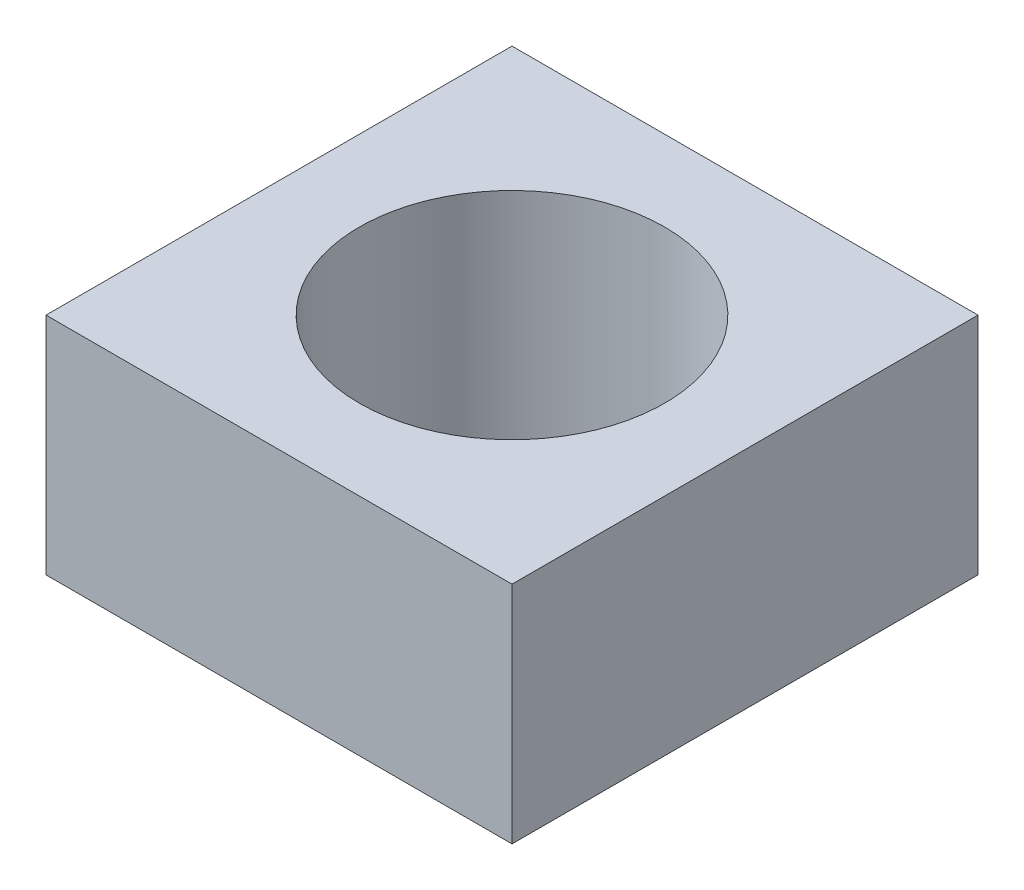
ISO-10303-21;
HEADER;
FILE_DESCRIPTION(('STEP AP214'),'2;1');
FILE_NAME('part.step','',(''),(''),'','','');
FILE_SCHEMA(('AUTOMOTIVE_DESIGN { 1 0 10303 214 1 1 1 1 }'));
ENDSEC;
DATA;
#1=APPLICATION_CONTEXT('core data for automotive mechanical design processes');
#2=APPLICATION_PROTOCOL_DEFINITION('international standard','automotive_design',2000,#1);
#3=PRODUCT_CONTEXT('',#1,'mechanical');
#4=PRODUCT('Part','Part','',(#3));
#5=PRODUCT_RELATED_PRODUCT_CATEGORY('part','',(#4));
#6=PRODUCT_DEFINITION_FORMATION('','',#4);
#7=PRODUCT_DEFINITION_CONTEXT('part definition',#1,'design');
#8=PRODUCT_DEFINITION('design','',#6,#7);
#9=PRODUCT_DEFINITION_SHAPE('','',#8);
#10=(LENGTH_UNIT() NAMED_UNIT(*) SI_UNIT(.MILLI.,.METRE.));
#11=(NAMED_UNIT(*) PLANE_ANGLE_UNIT() SI_UNIT($,.RADIAN.));
#12=(NAMED_UNIT(*) SI_UNIT($,.STERADIAN.) SOLID_ANGLE_UNIT());
#13=UNCERTAINTY_MEASURE_WITH_UNIT(LENGTH_MEASURE(1.E-05),#10,'distance_accuracy_value','');
#14=(GEOMETRIC_REPRESENTATION_CONTEXT(3) GLOBAL_UNCERTAINTY_ASSIGNED_CONTEXT((#13)) GLOBAL_UNIT_ASSIGNED_CONTEXT((#10,
#11,#12)) REPRESENTATION_CONTEXT('',''));
#15=CARTESIAN_POINT('',(0.,0.,0.));
#16=DIRECTION('',(0.,0.,1.));
#17=DIRECTION('',(1.,0.,0.));
#18=AXIS2_PLACEMENT_3D('',#15,#16,#17);
#19=CARTESIAN_POINT('',(0.,7.,0.));
#20=DIRECTION('',(0.,1.,0.));
#21=DIRECTION('',(0.,0.,1.));
#22=AXIS2_PLACEMENT_3D('',#19,#20,#21);
#23=PLANE('',#22);
#24=DIRECTION('',(0.,0.,-1.));
#25=VECTOR('',#24,1.);
#26=CARTESIAN_POINT('',(7.25,7.,-7.25));
#27=LINE('',#26,#25);
#28=CARTESIAN_POINT('',(7.25,7.,7.25000000000001));
#29=VERTEX_POINT('',#28);
#30=CARTESIAN_POINT('',(7.25,7.,-7.25));
#31=VERTEX_POINT('',#30);
#32=EDGE_CURVE('E92',#29,#31,#27,.T.);
#33=ORIENTED_EDGE('',*,*,#32,.T.);
#34=DIRECTION('',(-1.,0.,0.));
#35=VECTOR('',#34,1.);
#36=CARTESIAN_POINT('',(-7.25000000000001,7.,-7.25000000000001));
#37=LINE('',#36,#35);
#38=CARTESIAN_POINT('',(-7.25000000000001,7.,-7.25000000000001));
#39=VERTEX_POINT('',#38);
#40=EDGE_CURVE('E87',#31,#39,#37,.T.);
#41=ORIENTED_EDGE('',*,*,#40,.T.);
#42=DIRECTION('',(0.,0.,1.));
#43=VECTOR('',#42,1.);
#44=CARTESIAN_POINT('',(-7.25000000000001,7.,-7.25000000000001));
#45=LINE('',#44,#43);
#46=CARTESIAN_POINT('',(-7.25000000000001,7.,7.25000000000001));
#47=VERTEX_POINT('',#46);
#48=EDGE_CURVE('E90',#39,#47,#45,.T.);
#49=ORIENTED_EDGE('',*,*,#48,.T.);
#50=DIRECTION('',(1.,0.,0.));
#51=VECTOR('',#50,1.);
#52=CARTESIAN_POINT('',(-7.25000000000001,7.,7.25000000000001));
#53=LINE('',#52,#51);
#54=EDGE_CURVE('E57',#47,#29,#53,.T.);
#55=ORIENTED_EDGE('',*,*,#54,.T.);
#56=EDGE_LOOP('',(#33,#41,#49,#55));
#57=FACE_BOUND('',#56,.T.);
#58=CARTESIAN_POINT('',(0.,7.,0.));
#59=DIRECTION('',(0.,1.,0.));
#60=DIRECTION('',(0.,0.,1.));
#61=AXIS2_PLACEMENT_3D('',#58,#59,#60);
#62=CIRCLE('',#61,4.75);
#63=CARTESIAN_POINT('',(0.,7.,4.75));
#64=VERTEX_POINT('',#63);
#65=EDGE_CURVE('E112',#64,#64,#62,.T.);
#66=ORIENTED_EDGE('',*,*,#65,.F.);
#67=EDGE_LOOP('',(#66));
#68=FACE_BOUND('',#67,.T.);
#69=ADVANCED_FACE('F39',(#57,#68),#23,.T.);
#70=CARTESIAN_POINT('',(0.,0.,0.));
#71=DIRECTION('',(0.,1.,0.));
#72=DIRECTION('',(0.,0.,1.));
#73=AXIS2_PLACEMENT_3D('',#70,#71,#72);
#74=PLANE('',#73);
#75=DIRECTION('',(0.,0.,-1.));
#76=VECTOR('',#75,1.);
#77=CARTESIAN_POINT('',(7.25,0.,-7.25));
#78=LINE('',#77,#76);
#79=CARTESIAN_POINT('',(7.25,0.,7.25000000000001));
#80=VERTEX_POINT('',#79);
#81=CARTESIAN_POINT('',(7.25,0.,-7.25));
#82=VERTEX_POINT('',#81);
#83=EDGE_CURVE('E108',#80,#82,#78,.T.);
#84=ORIENTED_EDGE('',*,*,#83,.F.);
#85=DIRECTION('',(1.,0.,0.));
#86=VECTOR('',#85,1.);
#87=CARTESIAN_POINT('',(-7.25000000000001,0.,7.25000000000001));
#88=LINE('',#87,#86);
#89=CARTESIAN_POINT('',(-7.25000000000001,0.,7.25000000000001));
#90=VERTEX_POINT('',#89);
#91=EDGE_CURVE('E80',#90,#80,#88,.T.);
#92=ORIENTED_EDGE('',*,*,#91,.F.);
#93=DIRECTION('',(0.,0.,1.));
#94=VECTOR('',#93,1.);
#95=CARTESIAN_POINT('',(-7.25000000000001,0.,-7.25000000000001));
#96=LINE('',#95,#94);
#97=CARTESIAN_POINT('',(-7.25000000000001,0.,-7.25000000000001));
#98=VERTEX_POINT('',#97);
#99=EDGE_CURVE('E74',#98,#90,#96,.T.);
#100=ORIENTED_EDGE('',*,*,#99,.F.);
#101=DIRECTION('',(-1.,0.,0.));
#102=VECTOR('',#101,1.);
#103=CARTESIAN_POINT('',(-7.25000000000001,0.,-7.25000000000001));
#104=LINE('',#103,#102);
#105=EDGE_CURVE('E97',#82,#98,#104,.T.);
#106=ORIENTED_EDGE('',*,*,#105,.F.);
#107=EDGE_LOOP('',(#84,#92,#100,#106));
#108=FACE_BOUND('',#107,.T.);
#109=CARTESIAN_POINT('',(0.,0.,0.));
#110=DIRECTION('',(0.,1.,0.));
#111=DIRECTION('',(0.,0.,1.));
#112=AXIS2_PLACEMENT_3D('',#109,#110,#111);
#113=CIRCLE('',#112,4.75);
#114=CARTESIAN_POINT('',(0.,0.,4.75));
#115=VERTEX_POINT('',#114);
#116=EDGE_CURVE('E130',#115,#115,#113,.T.);
#117=ORIENTED_EDGE('',*,*,#116,.T.);
#118=EDGE_LOOP('',(#117));
#119=FACE_BOUND('',#118,.T.);
#120=ADVANCED_FACE('F125',(#108,#119),#74,.F.);
#121=CARTESIAN_POINT('',(7.25,7.,-7.25));
#122=DIRECTION('',(-1.,0.,0.));
#123=DIRECTION('',(0.,0.,1.));
#124=AXIS2_PLACEMENT_3D('',#121,#122,#123);
#125=PLANE('',#124);
#126=ORIENTED_EDGE('',*,*,#83,.T.);
#127=DIRECTION('',(0.,-1.,0.));
#128=VECTOR('',#127,1.);
#129=CARTESIAN_POINT('',(7.25,7.,-7.25));
#130=LINE('',#129,#128);
#131=EDGE_CURVE('E11',#31,#82,#130,.T.);
#132=ORIENTED_EDGE('',*,*,#131,.F.);
#133=ORIENTED_EDGE('',*,*,#32,.F.);
#134=DIRECTION('',(0.,-1.,0.));
#135=VECTOR('',#134,1.);
#136=CARTESIAN_POINT('',(7.25,7.,7.25000000000001));
#137=LINE('',#136,#135);
#138=EDGE_CURVE('E104',#29,#80,#137,.T.);
#139=ORIENTED_EDGE('',*,*,#138,.T.);
#140=EDGE_LOOP('',(#126,#132,#133,#139));
#141=FACE_BOUND('',#140,.T.);
#142=ADVANCED_FACE('F41',(#141),#125,.F.);
#143=CARTESIAN_POINT('',(-7.25000000000001,7.,-7.25000000000001));
#144=DIRECTION('',(0.,0.,1.));
#145=DIRECTION('',(1.,0.,0.));
#146=AXIS2_PLACEMENT_3D('',#143,#144,#145);
#147=PLANE('',#146);
#148=ORIENTED_EDGE('',*,*,#105,.T.);
#149=DIRECTION('',(0.,-1.,0.));
#150=VECTOR('',#149,1.);
#151=CARTESIAN_POINT('',(-7.25000000000001,7.,-7.25000000000001));
#152=LINE('',#151,#150);
#153=EDGE_CURVE('E49',#39,#98,#152,.T.);
#154=ORIENTED_EDGE('',*,*,#153,.F.);
#155=ORIENTED_EDGE('',*,*,#40,.F.);
#156=ORIENTED_EDGE('',*,*,#131,.T.);
#157=EDGE_LOOP('',(#148,#154,#155,#156));
#158=FACE_BOUND('',#157,.T.);
#159=ADVANCED_FACE('F96',(#158),#147,.F.);
#160=CARTESIAN_POINT('',(-7.25000000000001,7.,-7.25000000000001));
#161=DIRECTION('',(1.,0.,0.));
#162=DIRECTION('',(0.,0.,-1.));
#163=AXIS2_PLACEMENT_3D('',#160,#161,#162);
#164=PLANE('',#163);
#165=ORIENTED_EDGE('',*,*,#99,.T.);
#166=DIRECTION('',(0.,-1.,0.));
#167=VECTOR('',#166,1.);
#168=CARTESIAN_POINT('',(-7.25000000000001,7.,7.25000000000001));
#169=LINE('',#168,#167);
#170=EDGE_CURVE('E99',#47,#90,#169,.T.);
#171=ORIENTED_EDGE('',*,*,#170,.F.);
#172=ORIENTED_EDGE('',*,*,#48,.F.);
#173=ORIENTED_EDGE('',*,*,#153,.T.);
#174=EDGE_LOOP('',(#165,#171,#172,#173));
#175=FACE_BOUND('',#174,.T.);
#176=ADVANCED_FACE('F100',(#175),#164,.F.);
#177=CARTESIAN_POINT('',(-7.25000000000001,7.,7.25000000000001));
#178=DIRECTION('',(0.,0.,-1.));
#179=DIRECTION('',(-1.,0.,0.));
#180=AXIS2_PLACEMENT_3D('',#177,#178,#179);
#181=PLANE('',#180);
#182=ORIENTED_EDGE('',*,*,#91,.T.);
#183=ORIENTED_EDGE('',*,*,#138,.F.);
#184=ORIENTED_EDGE('',*,*,#54,.F.);
#185=ORIENTED_EDGE('',*,*,#170,.T.);
#186=EDGE_LOOP('',(#182,#183,#184,#185));
#187=FACE_BOUND('',#186,.T.);
#188=ADVANCED_FACE('F122',(#187),#181,.F.);
#189=CARTESIAN_POINT('',(0.,7.,0.));
#190=DIRECTION('',(0.,-1.,0.));
#191=DIRECTION('',(0.,0.,-1.));
#192=AXIS2_PLACEMENT_3D('',#189,#190,#191);
#193=CYLINDRICAL_SURFACE('',#192,4.75);
#194=ORIENTED_EDGE('',*,*,#65,.T.);
#195=EDGE_LOOP('',(#194));
#196=FACE_BOUND('',#195,.T.);
#197=ORIENTED_EDGE('',*,*,#116,.F.);
#198=EDGE_LOOP('',(#197));
#199=FACE_BOUND('',#198,.T.);
#200=ADVANCED_FACE('F138',(#196,#199),#193,.F.);
#201=CLOSED_SHELL('',(#69,#120,#142,#159,#176,#188,#200));
#202=MANIFOLD_SOLID_BREP('B2',#201);
#203=ADVANCED_BREP_SHAPE_REPRESENTATION('',(#18,#202),#14);
#204=SHAPE_DEFINITION_REPRESENTATION(#9,#203);
ENDSEC;
END-ISO-10303-21;
